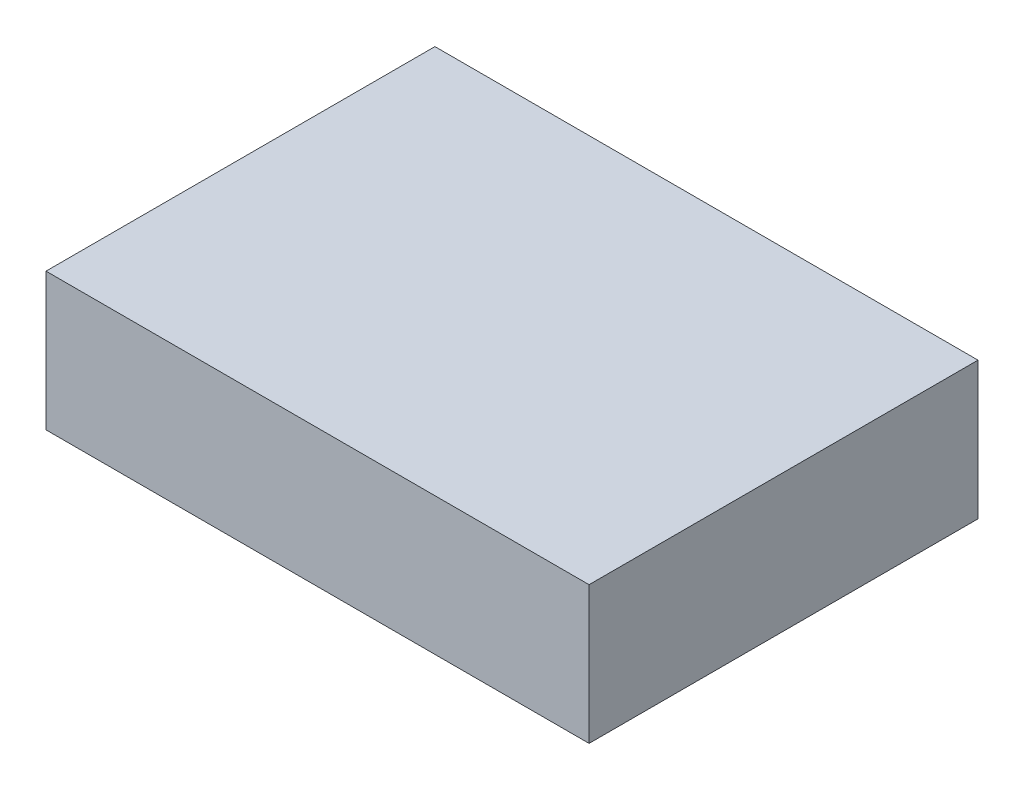
ISO-10303-21;
HEADER;
FILE_DESCRIPTION(('STEP AP214'),'2;1');
FILE_NAME('part.step','',(''),(''),'','','');
FILE_SCHEMA(('AUTOMOTIVE_DESIGN { 1 0 10303 214 1 1 1 1 }'));
ENDSEC;
DATA;
#1=APPLICATION_CONTEXT('core data for automotive mechanical design processes');
#2=APPLICATION_PROTOCOL_DEFINITION('international standard','automotive_design',2000,#1);
#3=PRODUCT_CONTEXT('',#1,'mechanical');
#4=PRODUCT('Part','Part','',(#3));
#5=PRODUCT_RELATED_PRODUCT_CATEGORY('part','',(#4));
#6=PRODUCT_DEFINITION_FORMATION('','',#4);
#7=PRODUCT_DEFINITION_CONTEXT('part definition',#1,'design');
#8=PRODUCT_DEFINITION('design','',#6,#7);
#9=PRODUCT_DEFINITION_SHAPE('','',#8);
#10=(LENGTH_UNIT() NAMED_UNIT(*) SI_UNIT(.MILLI.,.METRE.));
#11=(NAMED_UNIT(*) PLANE_ANGLE_UNIT() SI_UNIT($,.RADIAN.));
#12=(NAMED_UNIT(*) SI_UNIT($,.STERADIAN.) SOLID_ANGLE_UNIT());
#13=UNCERTAINTY_MEASURE_WITH_UNIT(LENGTH_MEASURE(1.E-05),#10,'distance_accuracy_value','');
#14=(GEOMETRIC_REPRESENTATION_CONTEXT(3) GLOBAL_UNCERTAINTY_ASSIGNED_CONTEXT((#13)) GLOBAL_UNIT_ASSIGNED_CONTEXT((#10,
#11,#12)) REPRESENTATION_CONTEXT('',''));
#15=CARTESIAN_POINT('',(0.,0.,0.));
#16=DIRECTION('',(0.,0.,1.));
#17=DIRECTION('',(1.,0.,0.));
#18=AXIS2_PLACEMENT_3D('',#15,#16,#17);
#19=CARTESIAN_POINT('',(0.,33.0460220728574,0.));
#20=DIRECTION('',(1.,0.,0.));
#21=DIRECTION('',(0.,0.,-1.));
#22=AXIS2_PLACEMENT_3D('',#19,#20,#21);
#23=PLANE('',#22);
#24=DIRECTION('',(0.,0.,1.));
#25=VECTOR('',#24,1.);
#26=CARTESIAN_POINT('',(0.,0.,0.));
#27=LINE('',#26,#25);
#28=CARTESIAN_POINT('',(0.,0.,-93.4974014014014));
#29=VERTEX_POINT('',#28);
#30=CARTESIAN_POINT('',(0.,0.,0.));
#31=VERTEX_POINT('',#30);
#32=EDGE_CURVE('E97',#29,#31,#27,.T.);
#33=ORIENTED_EDGE('',*,*,#32,.T.);
#34=DIRECTION('',(0.,-1.,0.));
#35=VECTOR('',#34,1.);
#36=CARTESIAN_POINT('',(0.,33.0460220728574,0.));
#37=LINE('',#36,#35);
#38=CARTESIAN_POINT('',(0.,33.0460220728574,0.));
#39=VERTEX_POINT('',#38);
#40=EDGE_CURVE('E11',#39,#31,#37,.T.);
#41=ORIENTED_EDGE('',*,*,#40,.F.);
#42=DIRECTION('',(0.,0.,1.));
#43=VECTOR('',#42,1.);
#44=CARTESIAN_POINT('',(0.,33.0460220728574,0.));
#45=LINE('',#44,#43);
#46=CARTESIAN_POINT('',(0.,33.0460220728574,-93.4974014014014));
#47=VERTEX_POINT('',#46);
#48=EDGE_CURVE('E85',#47,#39,#45,.T.);
#49=ORIENTED_EDGE('',*,*,#48,.F.);
#50=DIRECTION('',(0.,-1.,0.));
#51=VECTOR('',#50,1.);
#52=CARTESIAN_POINT('',(0.,33.0460220728574,-93.4974014014014));
#53=LINE('',#52,#51);
#54=EDGE_CURVE('E93',#47,#29,#53,.T.);
#55=ORIENTED_EDGE('',*,*,#54,.T.);
#56=EDGE_LOOP('',(#33,#41,#49,#55));
#57=FACE_BOUND('',#56,.T.);
#58=ADVANCED_FACE('F34',(#57),#23,.F.);
#59=CARTESIAN_POINT('',(0.,33.0460220728574,0.));
#60=DIRECTION('',(0.,0.,-1.));
#61=DIRECTION('',(-1.,0.,0.));
#62=AXIS2_PLACEMENT_3D('',#59,#60,#61);
#63=PLANE('',#62);
#64=DIRECTION('',(1.,0.,0.));
#65=VECTOR('',#64,1.);
#66=CARTESIAN_POINT('',(0.,0.,0.));
#67=LINE('',#66,#65);
#68=CARTESIAN_POINT('',(130.554298298298,0.,0.));
#69=VERTEX_POINT('',#68);
#70=EDGE_CURVE('E89',#31,#69,#67,.T.);
#71=ORIENTED_EDGE('',*,*,#70,.T.);
#72=DIRECTION('',(0.,-1.,0.));
#73=VECTOR('',#72,1.);
#74=CARTESIAN_POINT('',(130.554298298298,33.0460220728574,0.));
#75=LINE('',#74,#73);
#76=CARTESIAN_POINT('',(130.554298298298,33.0460220728574,0.));
#77=VERTEX_POINT('',#76);
#78=EDGE_CURVE('E42',#77,#69,#75,.T.);
#79=ORIENTED_EDGE('',*,*,#78,.F.);
#80=DIRECTION('',(1.,0.,0.));
#81=VECTOR('',#80,1.);
#82=CARTESIAN_POINT('',(0.,33.0460220728574,0.));
#83=LINE('',#82,#81);
#84=EDGE_CURVE('E80',#39,#77,#83,.T.);
#85=ORIENTED_EDGE('',*,*,#84,.F.);
#86=ORIENTED_EDGE('',*,*,#40,.T.);
#87=EDGE_LOOP('',(#71,#79,#85,#86));
#88=FACE_BOUND('',#87,.T.);
#89=ADVANCED_FACE('F88',(#88),#63,.F.);
#90=CARTESIAN_POINT('',(130.554298298298,33.0460220728574,0.));
#91=DIRECTION('',(-1.,0.,0.));
#92=DIRECTION('',(0.,0.,1.));
#93=AXIS2_PLACEMENT_3D('',#90,#91,#92);
#94=PLANE('',#93);
#95=DIRECTION('',(0.,0.,-1.));
#96=VECTOR('',#95,1.);
#97=CARTESIAN_POINT('',(130.554298298298,0.,0.));
#98=LINE('',#97,#96);
#99=CARTESIAN_POINT('',(130.554298298298,0.,-93.4974014014014));
#100=VERTEX_POINT('',#99);
#101=EDGE_CURVE('E67',#69,#100,#98,.T.);
#102=ORIENTED_EDGE('',*,*,#101,.T.);
#103=DIRECTION('',(0.,-1.,0.));
#104=VECTOR('',#103,1.);
#105=CARTESIAN_POINT('',(130.554298298298,33.0460220728574,-93.4974014014014));
#106=LINE('',#105,#104);
#107=CARTESIAN_POINT('',(130.554298298298,33.0460220728574,-93.4974014014014));
#108=VERTEX_POINT('',#107);
#109=EDGE_CURVE('E90',#108,#100,#106,.T.);
#110=ORIENTED_EDGE('',*,*,#109,.F.);
#111=DIRECTION('',(0.,0.,-1.));
#112=VECTOR('',#111,1.);
#113=CARTESIAN_POINT('',(130.554298298298,33.0460220728574,0.));
#114=LINE('',#113,#112);
#115=EDGE_CURVE('E83',#77,#108,#114,.T.);
#116=ORIENTED_EDGE('',*,*,#115,.F.);
#117=ORIENTED_EDGE('',*,*,#78,.T.);
#118=EDGE_LOOP('',(#102,#110,#116,#117));
#119=FACE_BOUND('',#118,.T.);
#120=ADVANCED_FACE('F91',(#119),#94,.F.);
#121=CARTESIAN_POINT('',(0.,33.0460220728574,-93.4974014014014));
#122=DIRECTION('',(0.,0.,1.));
#123=DIRECTION('',(1.,0.,0.));
#124=AXIS2_PLACEMENT_3D('',#121,#122,#123);
#125=PLANE('',#124);
#126=DIRECTION('',(-1.,0.,0.));
#127=VECTOR('',#126,1.);
#128=CARTESIAN_POINT('',(0.,0.,-93.4974014014014));
#129=LINE('',#128,#127);
#130=EDGE_CURVE('E73',#100,#29,#129,.T.);
#131=ORIENTED_EDGE('',*,*,#130,.T.);
#132=ORIENTED_EDGE('',*,*,#54,.F.);
#133=DIRECTION('',(-1.,0.,0.));
#134=VECTOR('',#133,1.);
#135=CARTESIAN_POINT('',(0.,33.0460220728574,-93.4974014014014));
#136=LINE('',#135,#134);
#137=EDGE_CURVE('E50',#108,#47,#136,.T.);
#138=ORIENTED_EDGE('',*,*,#137,.F.);
#139=ORIENTED_EDGE('',*,*,#109,.T.);
#140=EDGE_LOOP('',(#131,#132,#138,#139));
#141=FACE_BOUND('',#140,.T.);
#142=ADVANCED_FACE('F104',(#141),#125,.F.);
#143=CARTESIAN_POINT('',(0.,33.0460220728574,0.));
#144=DIRECTION('',(0.,-1.,0.));
#145=DIRECTION('',(0.,0.,-1.));
#146=AXIS2_PLACEMENT_3D('',#143,#144,#145);
#147=PLANE('',#146);
#148=ORIENTED_EDGE('',*,*,#48,.T.);
#149=ORIENTED_EDGE('',*,*,#84,.T.);
#150=ORIENTED_EDGE('',*,*,#115,.T.);
#151=ORIENTED_EDGE('',*,*,#137,.T.);
#152=EDGE_LOOP('',(#148,#149,#150,#151));
#153=FACE_BOUND('',#152,.T.);
#154=ADVANCED_FACE('F81',(#153),#147,.F.);
#155=CARTESIAN_POINT('',(0.,0.,0.));
#156=DIRECTION('',(0.,-1.,0.));
#157=DIRECTION('',(0.,0.,-1.));
#158=AXIS2_PLACEMENT_3D('',#155,#156,#157);
#159=PLANE('',#158);
#160=ORIENTED_EDGE('',*,*,#32,.F.);
#161=ORIENTED_EDGE('',*,*,#130,.F.);
#162=ORIENTED_EDGE('',*,*,#101,.F.);
#163=ORIENTED_EDGE('',*,*,#70,.F.);
#164=EDGE_LOOP('',(#160,#161,#162,#163));
#165=FACE_BOUND('',#164,.T.);
#166=ADVANCED_FACE('F107',(#165),#159,.T.);
#167=CLOSED_SHELL('',(#58,#89,#120,#142,#154,#166));
#168=MANIFOLD_SOLID_BREP('B2',#167);
#169=ADVANCED_BREP_SHAPE_REPRESENTATION('',(#18,#168),#14);
#170=SHAPE_DEFINITION_REPRESENTATION(#9,#169);
ENDSEC;
END-ISO-10303-21;
